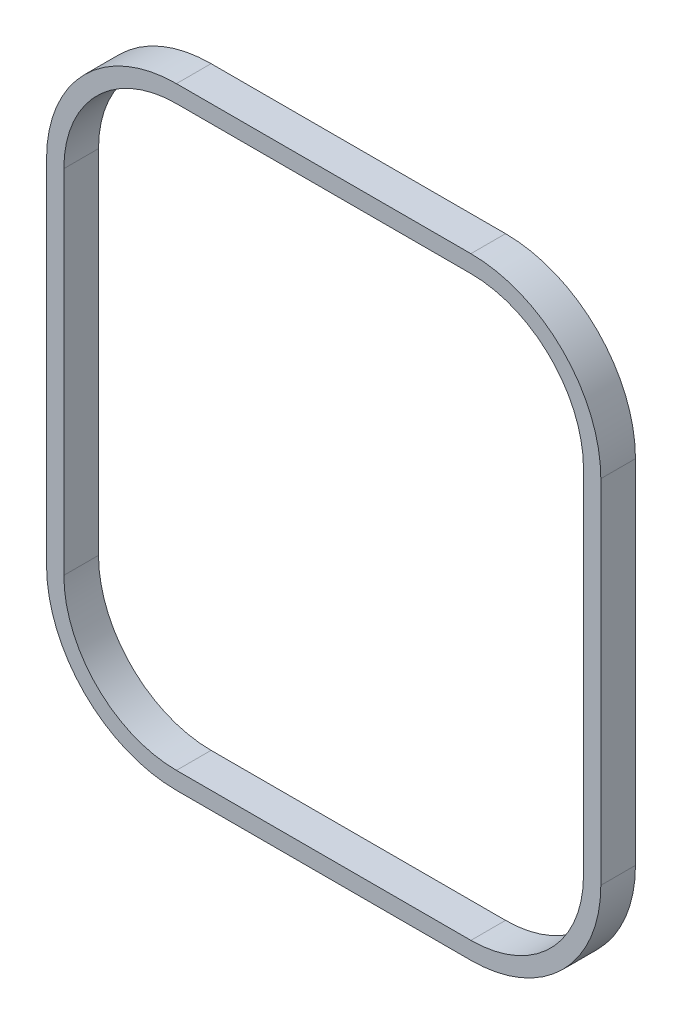
ISO-10303-21;
HEADER;
FILE_DESCRIPTION(('STEP AP214'),'2;1');
FILE_NAME('part.step','',(''),(''),'','','');
FILE_SCHEMA(('AUTOMOTIVE_DESIGN { 1 0 10303 214 1 1 1 1 }'));
ENDSEC;
DATA;
#1=APPLICATION_CONTEXT('core data for automotive mechanical design processes');
#2=APPLICATION_PROTOCOL_DEFINITION('international standard','automotive_design',2000,#1);
#3=PRODUCT_CONTEXT('',#1,'mechanical');
#4=PRODUCT('Part','Part','',(#3));
#5=PRODUCT_RELATED_PRODUCT_CATEGORY('part','',(#4));
#6=PRODUCT_DEFINITION_FORMATION('','',#4);
#7=PRODUCT_DEFINITION_CONTEXT('part definition',#1,'design');
#8=PRODUCT_DEFINITION('design','',#6,#7);
#9=PRODUCT_DEFINITION_SHAPE('','',#8);
#10=(LENGTH_UNIT() NAMED_UNIT(*) SI_UNIT(.MILLI.,.METRE.));
#11=(NAMED_UNIT(*) PLANE_ANGLE_UNIT() SI_UNIT($,.RADIAN.));
#12=(NAMED_UNIT(*) SI_UNIT($,.STERADIAN.) SOLID_ANGLE_UNIT());
#13=UNCERTAINTY_MEASURE_WITH_UNIT(LENGTH_MEASURE(1.E-05),#10,'distance_accuracy_value','');
#14=(GEOMETRIC_REPRESENTATION_CONTEXT(3) GLOBAL_UNCERTAINTY_ASSIGNED_CONTEXT((#13)) GLOBAL_UNIT_ASSIGNED_CONTEXT((#10,
#11,#12)) REPRESENTATION_CONTEXT('',''));
#15=CARTESIAN_POINT('',(0.,0.,0.));
#16=DIRECTION('',(0.,0.,1.));
#17=DIRECTION('',(1.,0.,0.));
#18=AXIS2_PLACEMENT_3D('',#15,#16,#17);
#19=CARTESIAN_POINT('',(51.,-61.,12.));
#20=DIRECTION('',(0.,0.,1.));
#21=DIRECTION('',(1.,0.,0.));
#22=AXIS2_PLACEMENT_3D('',#19,#20,#21);
#23=PLANE('',#22);
#24=CARTESIAN_POINT('',(51.,-61.,12.));
#25=DIRECTION('',(0.,0.,1.));
#26=DIRECTION('',(1.,0.,0.));
#27=AXIS2_PLACEMENT_3D('',#24,#25,#26);
#28=CIRCLE('',#27,45.);
#29=CARTESIAN_POINT('',(51.,-106.,12.));
#30=VERTEX_POINT('',#29);
#31=CARTESIAN_POINT('',(96.,-61.,12.));
#32=VERTEX_POINT('',#31);
#33=EDGE_CURVE('E261',#30,#32,#28,.T.);
#34=ORIENTED_EDGE('',*,*,#33,.T.);
#35=DIRECTION('',(0.,1.,0.));
#36=VECTOR('',#35,1.);
#37=CARTESIAN_POINT('',(96.,61.,12.));
#38=LINE('',#37,#36);
#39=CARTESIAN_POINT('',(96.,61.,12.));
#40=VERTEX_POINT('',#39);
#41=EDGE_CURVE('E264',#32,#40,#38,.T.);
#42=ORIENTED_EDGE('',*,*,#41,.T.);
#43=CARTESIAN_POINT('',(51.,61.,12.));
#44=DIRECTION('',(0.,0.,1.));
#45=DIRECTION('',(1.,0.,0.));
#46=AXIS2_PLACEMENT_3D('',#43,#44,#45);
#47=CIRCLE('',#46,45.);
#48=CARTESIAN_POINT('',(51.,106.,12.));
#49=VERTEX_POINT('',#48);
#50=EDGE_CURVE('E267',#40,#49,#47,.T.);
#51=ORIENTED_EDGE('',*,*,#50,.T.);
#52=DIRECTION('',(-1.,0.,0.));
#53=VECTOR('',#52,1.);
#54=CARTESIAN_POINT('',(-51.,106.,12.));
#55=LINE('',#54,#53);
#56=CARTESIAN_POINT('',(-51.,106.,12.));
#57=VERTEX_POINT('',#56);
#58=EDGE_CURVE('E269',#49,#57,#55,.T.);
#59=ORIENTED_EDGE('',*,*,#58,.T.);
#60=CARTESIAN_POINT('',(-51.,61.,12.));
#61=DIRECTION('',(0.,0.,1.));
#62=DIRECTION('',(1.,0.,0.));
#63=AXIS2_PLACEMENT_3D('',#60,#61,#62);
#64=CIRCLE('',#63,45.);
#65=CARTESIAN_POINT('',(-96.,61.,12.));
#66=VERTEX_POINT('',#65);
#67=EDGE_CURVE('E271',#57,#66,#64,.T.);
#68=ORIENTED_EDGE('',*,*,#67,.T.);
#69=DIRECTION('',(0.,-1.,0.));
#70=VECTOR('',#69,1.);
#71=CARTESIAN_POINT('',(-96.,61.,12.));
#72=LINE('',#71,#70);
#73=CARTESIAN_POINT('',(-96.,-61.,12.));
#74=VERTEX_POINT('',#73);
#75=EDGE_CURVE('E273',#66,#74,#72,.T.);
#76=ORIENTED_EDGE('',*,*,#75,.T.);
#77=CARTESIAN_POINT('',(-51.,-61.,12.));
#78=DIRECTION('',(0.,0.,1.));
#79=DIRECTION('',(1.,0.,0.));
#80=AXIS2_PLACEMENT_3D('',#77,#78,#79);
#81=CIRCLE('',#80,45.);
#82=CARTESIAN_POINT('',(-51.,-106.,12.));
#83=VERTEX_POINT('',#82);
#84=EDGE_CURVE('E275',#74,#83,#81,.T.);
#85=ORIENTED_EDGE('',*,*,#84,.T.);
#86=DIRECTION('',(1.,0.,0.));
#87=VECTOR('',#86,1.);
#88=CARTESIAN_POINT('',(-51.,-106.,12.));
#89=LINE('',#88,#87);
#90=EDGE_CURVE('E277',#83,#30,#89,.T.);
#91=ORIENTED_EDGE('',*,*,#90,.T.);
#92=EDGE_LOOP('',(#34,#42,#51,#59,#68,#76,#85,#91));
#93=FACE_BOUND('',#92,.T.);
#94=DIRECTION('',(0.,1.,0.));
#95=VECTOR('',#94,1.);
#96=CARTESIAN_POINT('',(90.,61.,12.));
#97=LINE('',#96,#95);
#98=CARTESIAN_POINT('',(90.,-61.,12.));
#99=VERTEX_POINT('',#98);
#100=CARTESIAN_POINT('',(90.,61.,12.));
#101=VERTEX_POINT('',#100);
#102=EDGE_CURVE('E204',#99,#101,#97,.T.);
#103=ORIENTED_EDGE('',*,*,#102,.F.);
#104=CARTESIAN_POINT('',(51.,-61.,12.));
#105=DIRECTION('',(0.,0.,1.));
#106=DIRECTION('',(1.,0.,0.));
#107=AXIS2_PLACEMENT_3D('',#104,#105,#106);
#108=CIRCLE('',#107,39.);
#109=CARTESIAN_POINT('',(51.,-100.,12.));
#110=VERTEX_POINT('',#109);
#111=EDGE_CURVE('E196',#110,#99,#108,.T.);
#112=ORIENTED_EDGE('',*,*,#111,.F.);
#113=DIRECTION('',(1.,0.,0.));
#114=VECTOR('',#113,1.);
#115=CARTESIAN_POINT('',(-51.,-100.,12.));
#116=LINE('',#115,#114);
#117=CARTESIAN_POINT('',(-51.,-100.,12.));
#118=VERTEX_POINT('',#117);
#119=EDGE_CURVE('E229',#118,#110,#116,.T.);
#120=ORIENTED_EDGE('',*,*,#119,.F.);
#121=CARTESIAN_POINT('',(-51.,-61.,12.));
#122=DIRECTION('',(0.,0.,1.));
#123=DIRECTION('',(1.,0.,0.));
#124=AXIS2_PLACEMENT_3D('',#121,#122,#123);
#125=CIRCLE('',#124,39.);
#126=CARTESIAN_POINT('',(-90.,-61.,12.));
#127=VERTEX_POINT('',#126);
#128=EDGE_CURVE('E227',#127,#118,#125,.T.);
#129=ORIENTED_EDGE('',*,*,#128,.F.);
#130=DIRECTION('',(0.,-1.,0.));
#131=VECTOR('',#130,1.);
#132=CARTESIAN_POINT('',(-90.,61.,12.));
#133=LINE('',#132,#131);
#134=CARTESIAN_POINT('',(-90.,61.,12.));
#135=VERTEX_POINT('',#134);
#136=EDGE_CURVE('E225',#135,#127,#133,.T.);
#137=ORIENTED_EDGE('',*,*,#136,.F.);
#138=CARTESIAN_POINT('',(-51.,61.,12.));
#139=DIRECTION('',(0.,0.,1.));
#140=DIRECTION('',(1.,0.,0.));
#141=AXIS2_PLACEMENT_3D('',#138,#139,#140);
#142=CIRCLE('',#141,39.);
#143=CARTESIAN_POINT('',(-51.,100.,12.));
#144=VERTEX_POINT('',#143);
#145=EDGE_CURVE('E223',#144,#135,#142,.T.);
#146=ORIENTED_EDGE('',*,*,#145,.F.);
#147=DIRECTION('',(-1.,0.,0.));
#148=VECTOR('',#147,1.);
#149=CARTESIAN_POINT('',(-51.,100.,12.));
#150=LINE('',#149,#148);
#151=CARTESIAN_POINT('',(51.,100.,12.));
#152=VERTEX_POINT('',#151);
#153=EDGE_CURVE('E219',#152,#144,#150,.T.);
#154=ORIENTED_EDGE('',*,*,#153,.F.);
#155=CARTESIAN_POINT('',(51.,61.,12.));
#156=DIRECTION('',(0.,0.,1.));
#157=DIRECTION('',(-1.,0.,0.));
#158=AXIS2_PLACEMENT_3D('',#155,#156,#157);
#159=CIRCLE('',#158,39.);
#160=EDGE_CURVE('E217',#101,#152,#159,.T.);
#161=ORIENTED_EDGE('',*,*,#160,.F.);
#162=EDGE_LOOP('',(#103,#112,#120,#129,#137,#146,#154,#161));
#163=FACE_BOUND('',#162,.T.);
#164=ADVANCED_FACE('F83',(#93,#163),#23,.T.);
#165=CARTESIAN_POINT('',(51.,-61.,0.));
#166=DIRECTION('',(0.,0.,1.));
#167=DIRECTION('',(1.,0.,0.));
#168=AXIS2_PLACEMENT_3D('',#165,#166,#167);
#169=PLANE('',#168);
#170=CARTESIAN_POINT('',(51.,-61.,0.));
#171=DIRECTION('',(0.,0.,1.));
#172=DIRECTION('',(1.,0.,0.));
#173=AXIS2_PLACEMENT_3D('',#170,#171,#172);
#174=CIRCLE('',#173,45.);
#175=CARTESIAN_POINT('',(51.,-106.,0.));
#176=VERTEX_POINT('',#175);
#177=CARTESIAN_POINT('',(96.,-61.,0.));
#178=VERTEX_POINT('',#177);
#179=EDGE_CURVE('E212',#176,#178,#174,.T.);
#180=ORIENTED_EDGE('',*,*,#179,.F.);
#181=DIRECTION('',(1.,0.,0.));
#182=VECTOR('',#181,1.);
#183=CARTESIAN_POINT('',(-51.,-106.,0.));
#184=LINE('',#183,#182);
#185=CARTESIAN_POINT('',(-51.,-106.,0.));
#186=VERTEX_POINT('',#185);
#187=EDGE_CURVE('E265',#186,#176,#184,.T.);
#188=ORIENTED_EDGE('',*,*,#187,.F.);
#189=CARTESIAN_POINT('',(-51.,-61.,0.));
#190=DIRECTION('',(0.,0.,1.));
#191=DIRECTION('',(1.,0.,0.));
#192=AXIS2_PLACEMENT_3D('',#189,#190,#191);
#193=CIRCLE('',#192,45.);
#194=CARTESIAN_POINT('',(-96.,-61.,0.));
#195=VERTEX_POINT('',#194);
#196=EDGE_CURVE('E292',#195,#186,#193,.T.);
#197=ORIENTED_EDGE('',*,*,#196,.F.);
#198=DIRECTION('',(0.,-1.,0.));
#199=VECTOR('',#198,1.);
#200=CARTESIAN_POINT('',(-96.,61.,0.));
#201=LINE('',#200,#199);
#202=CARTESIAN_POINT('',(-96.,61.,0.));
#203=VERTEX_POINT('',#202);
#204=EDGE_CURVE('E290',#203,#195,#201,.T.);
#205=ORIENTED_EDGE('',*,*,#204,.F.);
#206=CARTESIAN_POINT('',(-51.,61.,0.));
#207=DIRECTION('',(0.,0.,1.));
#208=DIRECTION('',(1.,0.,0.));
#209=AXIS2_PLACEMENT_3D('',#206,#207,#208);
#210=CIRCLE('',#209,45.);
#211=CARTESIAN_POINT('',(-51.,106.,0.));
#212=VERTEX_POINT('',#211);
#213=EDGE_CURVE('E288',#212,#203,#210,.T.);
#214=ORIENTED_EDGE('',*,*,#213,.F.);
#215=DIRECTION('',(-1.,0.,0.));
#216=VECTOR('',#215,1.);
#217=CARTESIAN_POINT('',(-51.,106.,0.));
#218=LINE('',#217,#216);
#219=CARTESIAN_POINT('',(51.,106.,0.));
#220=VERTEX_POINT('',#219);
#221=EDGE_CURVE('E286',#220,#212,#218,.T.);
#222=ORIENTED_EDGE('',*,*,#221,.F.);
#223=CARTESIAN_POINT('',(51.,61.,0.));
#224=DIRECTION('',(0.,0.,1.));
#225=DIRECTION('',(1.,0.,0.));
#226=AXIS2_PLACEMENT_3D('',#223,#224,#225);
#227=CIRCLE('',#226,45.);
#228=CARTESIAN_POINT('',(96.,61.,0.));
#229=VERTEX_POINT('',#228);
#230=EDGE_CURVE('E284',#229,#220,#227,.T.);
#231=ORIENTED_EDGE('',*,*,#230,.F.);
#232=DIRECTION('',(0.,1.,0.));
#233=VECTOR('',#232,1.);
#234=CARTESIAN_POINT('',(96.,61.,0.));
#235=LINE('',#234,#233);
#236=EDGE_CURVE('E282',#178,#229,#235,.T.);
#237=ORIENTED_EDGE('',*,*,#236,.F.);
#238=EDGE_LOOP('',(#180,#188,#197,#205,#214,#222,#231,#237));
#239=FACE_BOUND('',#238,.T.);
#240=CARTESIAN_POINT('',(51.,-61.,0.));
#241=DIRECTION('',(0.,0.,1.));
#242=DIRECTION('',(1.,0.,0.));
#243=AXIS2_PLACEMENT_3D('',#240,#241,#242);
#244=CIRCLE('',#243,39.);
#245=CARTESIAN_POINT('',(51.,-100.,0.));
#246=VERTEX_POINT('',#245);
#247=CARTESIAN_POINT('',(90.,-61.,0.));
#248=VERTEX_POINT('',#247);
#249=EDGE_CURVE('E106',#246,#248,#244,.T.);
#250=ORIENTED_EDGE('',*,*,#249,.T.);
#251=DIRECTION('',(0.,1.,0.));
#252=VECTOR('',#251,1.);
#253=CARTESIAN_POINT('',(90.,61.,0.));
#254=LINE('',#253,#252);
#255=CARTESIAN_POINT('',(90.,61.,0.));
#256=VERTEX_POINT('',#255);
#257=EDGE_CURVE('E211',#248,#256,#254,.T.);
#258=ORIENTED_EDGE('',*,*,#257,.T.);
#259=CARTESIAN_POINT('',(51.,61.,0.));
#260=DIRECTION('',(0.,0.,1.));
#261=DIRECTION('',(-1.,0.,0.));
#262=AXIS2_PLACEMENT_3D('',#259,#260,#261);
#263=CIRCLE('',#262,39.);
#264=CARTESIAN_POINT('',(51.,100.,0.));
#265=VERTEX_POINT('',#264);
#266=EDGE_CURVE('E233',#256,#265,#263,.T.);
#267=ORIENTED_EDGE('',*,*,#266,.T.);
#268=DIRECTION('',(-1.,0.,0.));
#269=VECTOR('',#268,1.);
#270=CARTESIAN_POINT('',(-51.,100.,0.));
#271=LINE('',#270,#269);
#272=CARTESIAN_POINT('',(-51.,100.,0.));
#273=VERTEX_POINT('',#272);
#274=EDGE_CURVE('E236',#265,#273,#271,.T.);
#275=ORIENTED_EDGE('',*,*,#274,.T.);
#276=CARTESIAN_POINT('',(-51.,61.,0.));
#277=DIRECTION('',(0.,0.,1.));
#278=DIRECTION('',(1.,0.,0.));
#279=AXIS2_PLACEMENT_3D('',#276,#277,#278);
#280=CIRCLE('',#279,39.);
#281=CARTESIAN_POINT('',(-90.,61.,0.));
#282=VERTEX_POINT('',#281);
#283=EDGE_CURVE('E239',#273,#282,#280,.T.);
#284=ORIENTED_EDGE('',*,*,#283,.T.);
#285=DIRECTION('',(0.,-1.,0.));
#286=VECTOR('',#285,1.);
#287=CARTESIAN_POINT('',(-90.,61.,0.));
#288=LINE('',#287,#286);
#289=CARTESIAN_POINT('',(-90.,-61.,0.));
#290=VERTEX_POINT('',#289);
#291=EDGE_CURVE('E242',#282,#290,#288,.T.);
#292=ORIENTED_EDGE('',*,*,#291,.T.);
#293=CARTESIAN_POINT('',(-51.,-61.,0.));
#294=DIRECTION('',(0.,0.,1.));
#295=DIRECTION('',(1.,0.,0.));
#296=AXIS2_PLACEMENT_3D('',#293,#294,#295);
#297=CIRCLE('',#296,39.);
#298=CARTESIAN_POINT('',(-51.,-100.,0.));
#299=VERTEX_POINT('',#298);
#300=EDGE_CURVE('E245',#290,#299,#297,.T.);
#301=ORIENTED_EDGE('',*,*,#300,.T.);
#302=DIRECTION('',(1.,0.,0.));
#303=VECTOR('',#302,1.);
#304=CARTESIAN_POINT('',(-51.,-100.,0.));
#305=LINE('',#304,#303);
#306=EDGE_CURVE('E205',#299,#246,#305,.T.);
#307=ORIENTED_EDGE('',*,*,#306,.T.);
#308=EDGE_LOOP('',(#250,#258,#267,#275,#284,#292,#301,#307));
#309=FACE_BOUND('',#308,.T.);
#310=ADVANCED_FACE('F322',(#239,#309),#169,.F.);
#311=CARTESIAN_POINT('',(51.,-61.,12.));
#312=DIRECTION('',(0.,0.,-1.));
#313=DIRECTION('',(-1.,0.,0.));
#314=AXIS2_PLACEMENT_3D('',#311,#312,#313);
#315=CYLINDRICAL_SURFACE('',#314,45.);
#316=ORIENTED_EDGE('',*,*,#179,.T.);
#317=DIRECTION('',(0.,0.,-1.));
#318=VECTOR('',#317,1.);
#319=CARTESIAN_POINT('',(96.,-61.,12.));
#320=LINE('',#319,#318);
#321=EDGE_CURVE('E12',#32,#178,#320,.T.);
#322=ORIENTED_EDGE('',*,*,#321,.F.);
#323=ORIENTED_EDGE('',*,*,#33,.F.);
#324=DIRECTION('',(0.,0.,-1.));
#325=VECTOR('',#324,1.);
#326=CARTESIAN_POINT('',(51.,-106.,12.));
#327=LINE('',#326,#325);
#328=EDGE_CURVE('E279',#30,#176,#327,.T.);
#329=ORIENTED_EDGE('',*,*,#328,.T.);
#330=EDGE_LOOP('',(#316,#322,#323,#329));
#331=FACE_BOUND('',#330,.T.);
#332=ADVANCED_FACE('F85',(#331),#315,.T.);
#333=CARTESIAN_POINT('',(96.,61.,12.));
#334=DIRECTION('',(-1.,0.,0.));
#335=DIRECTION('',(0.,-1.,0.));
#336=AXIS2_PLACEMENT_3D('',#333,#334,#335);
#337=PLANE('',#336);
#338=ORIENTED_EDGE('',*,*,#236,.T.);
#339=DIRECTION('',(0.,0.,-1.));
#340=VECTOR('',#339,1.);
#341=CARTESIAN_POINT('',(96.,61.,12.));
#342=LINE('',#341,#340);
#343=EDGE_CURVE('E91',#40,#229,#342,.T.);
#344=ORIENTED_EDGE('',*,*,#343,.F.);
#345=ORIENTED_EDGE('',*,*,#41,.F.);
#346=ORIENTED_EDGE('',*,*,#321,.T.);
#347=EDGE_LOOP('',(#338,#344,#345,#346));
#348=FACE_BOUND('',#347,.T.);
#349=ADVANCED_FACE('F339',(#348),#337,.F.);
#350=CARTESIAN_POINT('',(51.,61.,12.));
#351=DIRECTION('',(0.,0.,-1.));
#352=DIRECTION('',(-1.,0.,0.));
#353=AXIS2_PLACEMENT_3D('',#350,#351,#352);
#354=CYLINDRICAL_SURFACE('',#353,45.);
#355=ORIENTED_EDGE('',*,*,#230,.T.);
#356=DIRECTION('',(0.,0.,-1.));
#357=VECTOR('',#356,1.);
#358=CARTESIAN_POINT('',(51.,106.,12.));
#359=LINE('',#358,#357);
#360=EDGE_CURVE('E309',#49,#220,#359,.T.);
#361=ORIENTED_EDGE('',*,*,#360,.F.);
#362=ORIENTED_EDGE('',*,*,#50,.F.);
#363=ORIENTED_EDGE('',*,*,#343,.T.);
#364=EDGE_LOOP('',(#355,#361,#362,#363));
#365=FACE_BOUND('',#364,.T.);
#366=ADVANCED_FACE('F316',(#365),#354,.T.);
#367=CARTESIAN_POINT('',(-51.,106.,12.));
#368=DIRECTION('',(0.,-1.,0.));
#369=DIRECTION('',(0.,0.,-1.));
#370=AXIS2_PLACEMENT_3D('',#367,#368,#369);
#371=PLANE('',#370);
#372=ORIENTED_EDGE('',*,*,#221,.T.);
#373=DIRECTION('',(0.,0.,-1.));
#374=VECTOR('',#373,1.);
#375=CARTESIAN_POINT('',(-51.,106.,12.));
#376=LINE('',#375,#374);
#377=EDGE_CURVE('E306',#57,#212,#376,.T.);
#378=ORIENTED_EDGE('',*,*,#377,.F.);
#379=ORIENTED_EDGE('',*,*,#58,.F.);
#380=ORIENTED_EDGE('',*,*,#360,.T.);
#381=EDGE_LOOP('',(#372,#378,#379,#380));
#382=FACE_BOUND('',#381,.T.);
#383=ADVANCED_FACE('F328',(#382),#371,.F.);
#384=CARTESIAN_POINT('',(-51.,61.,12.));
#385=DIRECTION('',(0.,0.,-1.));
#386=DIRECTION('',(-1.,0.,0.));
#387=AXIS2_PLACEMENT_3D('',#384,#385,#386);
#388=CYLINDRICAL_SURFACE('',#387,45.);
#389=ORIENTED_EDGE('',*,*,#213,.T.);
#390=DIRECTION('',(0.,0.,-1.));
#391=VECTOR('',#390,1.);
#392=CARTESIAN_POINT('',(-96.,61.,12.));
#393=LINE('',#392,#391);
#394=EDGE_CURVE('E303',#66,#203,#393,.T.);
#395=ORIENTED_EDGE('',*,*,#394,.F.);
#396=ORIENTED_EDGE('',*,*,#67,.F.);
#397=ORIENTED_EDGE('',*,*,#377,.T.);
#398=EDGE_LOOP('',(#389,#395,#396,#397));
#399=FACE_BOUND('',#398,.T.);
#400=ADVANCED_FACE('F332',(#399),#388,.T.);
#401=CARTESIAN_POINT('',(-96.,61.,12.));
#402=DIRECTION('',(1.,0.,0.));
#403=DIRECTION('',(0.,1.,0.));
#404=AXIS2_PLACEMENT_3D('',#401,#402,#403);
#405=PLANE('',#404);
#406=ORIENTED_EDGE('',*,*,#204,.T.);
#407=DIRECTION('',(0.,0.,-1.));
#408=VECTOR('',#407,1.);
#409=CARTESIAN_POINT('',(-96.,-61.,12.));
#410=LINE('',#409,#408);
#411=EDGE_CURVE('E300',#74,#195,#410,.T.);
#412=ORIENTED_EDGE('',*,*,#411,.F.);
#413=ORIENTED_EDGE('',*,*,#75,.F.);
#414=ORIENTED_EDGE('',*,*,#394,.T.);
#415=EDGE_LOOP('',(#406,#412,#413,#414));
#416=FACE_BOUND('',#415,.T.);
#417=ADVANCED_FACE('F352',(#416),#405,.F.);
#418=CARTESIAN_POINT('',(-51.,-61.,12.));
#419=DIRECTION('',(0.,0.,-1.));
#420=DIRECTION('',(-1.,0.,0.));
#421=AXIS2_PLACEMENT_3D('',#418,#419,#420);
#422=CYLINDRICAL_SURFACE('',#421,45.);
#423=ORIENTED_EDGE('',*,*,#196,.T.);
#424=DIRECTION('',(0.,0.,-1.));
#425=VECTOR('',#424,1.);
#426=CARTESIAN_POINT('',(-51.,-106.,12.));
#427=LINE('',#426,#425);
#428=EDGE_CURVE('E297',#83,#186,#427,.T.);
#429=ORIENTED_EDGE('',*,*,#428,.F.);
#430=ORIENTED_EDGE('',*,*,#84,.F.);
#431=ORIENTED_EDGE('',*,*,#411,.T.);
#432=EDGE_LOOP('',(#423,#429,#430,#431));
#433=FACE_BOUND('',#432,.T.);
#434=ADVANCED_FACE('F350',(#433),#422,.T.);
#435=CARTESIAN_POINT('',(-51.,-106.,12.));
#436=DIRECTION('',(0.,1.,0.));
#437=DIRECTION('',(-1.,0.,0.));
#438=AXIS2_PLACEMENT_3D('',#435,#436,#437);
#439=PLANE('',#438);
#440=ORIENTED_EDGE('',*,*,#187,.T.);
#441=ORIENTED_EDGE('',*,*,#328,.F.);
#442=ORIENTED_EDGE('',*,*,#90,.F.);
#443=ORIENTED_EDGE('',*,*,#428,.T.);
#444=EDGE_LOOP('',(#440,#441,#442,#443));
#445=FACE_BOUND('',#444,.T.);
#446=ADVANCED_FACE('F345',(#445),#439,.F.);
#447=CARTESIAN_POINT('',(51.,-61.,12.));
#448=DIRECTION('',(0.,0.,-1.));
#449=DIRECTION('',(-1.,0.,0.));
#450=AXIS2_PLACEMENT_3D('',#447,#448,#449);
#451=CYLINDRICAL_SURFACE('',#450,39.);
#452=ORIENTED_EDGE('',*,*,#249,.F.);
#453=DIRECTION('',(0.,0.,-1.));
#454=VECTOR('',#453,1.);
#455=CARTESIAN_POINT('',(51.,-100.,12.));
#456=LINE('',#455,#454);
#457=EDGE_CURVE('E200',#110,#246,#456,.T.);
#458=ORIENTED_EDGE('',*,*,#457,.F.);
#459=ORIENTED_EDGE('',*,*,#111,.T.);
#460=DIRECTION('',(0.,0.,-1.));
#461=VECTOR('',#460,1.);
#462=CARTESIAN_POINT('',(90.,-61.,12.));
#463=LINE('',#462,#461);
#464=EDGE_CURVE('E199',#99,#248,#463,.T.);
#465=ORIENTED_EDGE('',*,*,#464,.T.);
#466=EDGE_LOOP('',(#452,#458,#459,#465));
#467=FACE_BOUND('',#466,.T.);
#468=ADVANCED_FACE('F198',(#467),#451,.F.);
#469=CARTESIAN_POINT('',(90.,61.,12.));
#470=DIRECTION('',(-1.,0.,0.));
#471=DIRECTION('',(0.,-1.,0.));
#472=AXIS2_PLACEMENT_3D('',#469,#470,#471);
#473=PLANE('',#472);
#474=ORIENTED_EDGE('',*,*,#257,.F.);
#475=ORIENTED_EDGE('',*,*,#464,.F.);
#476=ORIENTED_EDGE('',*,*,#102,.T.);
#477=DIRECTION('',(0.,0.,-1.));
#478=VECTOR('',#477,1.);
#479=CARTESIAN_POINT('',(90.,61.,12.));
#480=LINE('',#479,#478);
#481=EDGE_CURVE('E213',#101,#256,#480,.T.);
#482=ORIENTED_EDGE('',*,*,#481,.T.);
#483=EDGE_LOOP('',(#474,#475,#476,#482));
#484=FACE_BOUND('',#483,.T.);
#485=ADVANCED_FACE('F208',(#484),#473,.T.);
#486=CARTESIAN_POINT('',(51.,61.,12.));
#487=DIRECTION('',(0.,0.,-1.));
#488=DIRECTION('',(-1.,0.,0.));
#489=AXIS2_PLACEMENT_3D('',#486,#487,#488);
#490=CYLINDRICAL_SURFACE('',#489,39.);
#491=ORIENTED_EDGE('',*,*,#266,.F.);
#492=ORIENTED_EDGE('',*,*,#481,.F.);
#493=ORIENTED_EDGE('',*,*,#160,.T.);
#494=DIRECTION('',(0.,0.,-1.));
#495=VECTOR('',#494,1.);
#496=CARTESIAN_POINT('',(51.,100.,12.));
#497=LINE('',#496,#495);
#498=EDGE_CURVE('E258',#152,#265,#497,.T.);
#499=ORIENTED_EDGE('',*,*,#498,.T.);
#500=EDGE_LOOP('',(#491,#492,#493,#499));
#501=FACE_BOUND('',#500,.T.);
#502=ADVANCED_FACE('F377',(#501),#490,.F.);
#503=CARTESIAN_POINT('',(-51.,100.,12.));
#504=DIRECTION('',(0.,-1.,0.));
#505=DIRECTION('',(0.,0.,-1.));
#506=AXIS2_PLACEMENT_3D('',#503,#504,#505);
#507=PLANE('',#506);
#508=ORIENTED_EDGE('',*,*,#274,.F.);
#509=ORIENTED_EDGE('',*,*,#498,.F.);
#510=ORIENTED_EDGE('',*,*,#153,.T.);
#511=DIRECTION('',(0.,0.,-1.));
#512=VECTOR('',#511,1.);
#513=CARTESIAN_POINT('',(-51.,100.,12.));
#514=LINE('',#513,#512);
#515=EDGE_CURVE('E256',#144,#273,#514,.T.);
#516=ORIENTED_EDGE('',*,*,#515,.T.);
#517=EDGE_LOOP('',(#508,#509,#510,#516));
#518=FACE_BOUND('',#517,.T.);
#519=ADVANCED_FACE('F381',(#518),#507,.T.);
#520=CARTESIAN_POINT('',(-51.,61.,12.));
#521=DIRECTION('',(0.,0.,-1.));
#522=DIRECTION('',(-1.,0.,0.));
#523=AXIS2_PLACEMENT_3D('',#520,#521,#522);
#524=CYLINDRICAL_SURFACE('',#523,39.);
#525=ORIENTED_EDGE('',*,*,#283,.F.);
#526=ORIENTED_EDGE('',*,*,#515,.F.);
#527=ORIENTED_EDGE('',*,*,#145,.T.);
#528=DIRECTION('',(0.,0.,-1.));
#529=VECTOR('',#528,1.);
#530=CARTESIAN_POINT('',(-90.,61.,12.));
#531=LINE('',#530,#529);
#532=EDGE_CURVE('E254',#135,#282,#531,.T.);
#533=ORIENTED_EDGE('',*,*,#532,.T.);
#534=EDGE_LOOP('',(#525,#526,#527,#533));
#535=FACE_BOUND('',#534,.T.);
#536=ADVANCED_FACE('F387',(#535),#524,.F.);
#537=CARTESIAN_POINT('',(-90.,61.,12.));
#538=DIRECTION('',(1.,0.,0.));
#539=DIRECTION('',(0.,1.,0.));
#540=AXIS2_PLACEMENT_3D('',#537,#538,#539);
#541=PLANE('',#540);
#542=ORIENTED_EDGE('',*,*,#291,.F.);
#543=ORIENTED_EDGE('',*,*,#532,.F.);
#544=ORIENTED_EDGE('',*,*,#136,.T.);
#545=DIRECTION('',(0.,0.,-1.));
#546=VECTOR('',#545,1.);
#547=CARTESIAN_POINT('',(-90.,-61.,12.));
#548=LINE('',#547,#546);
#549=EDGE_CURVE('E252',#127,#290,#548,.T.);
#550=ORIENTED_EDGE('',*,*,#549,.T.);
#551=EDGE_LOOP('',(#542,#543,#544,#550));
#552=FACE_BOUND('',#551,.T.);
#553=ADVANCED_FACE('F391',(#552),#541,.T.);
#554=CARTESIAN_POINT('',(-51.,-61.,12.));
#555=DIRECTION('',(0.,0.,-1.));
#556=DIRECTION('',(-1.,0.,0.));
#557=AXIS2_PLACEMENT_3D('',#554,#555,#556);
#558=CYLINDRICAL_SURFACE('',#557,39.);
#559=ORIENTED_EDGE('',*,*,#300,.F.);
#560=ORIENTED_EDGE('',*,*,#549,.F.);
#561=ORIENTED_EDGE('',*,*,#128,.T.);
#562=DIRECTION('',(0.,0.,-1.));
#563=VECTOR('',#562,1.);
#564=CARTESIAN_POINT('',(-51.,-100.,12.));
#565=LINE('',#564,#563);
#566=EDGE_CURVE('E98',#118,#299,#565,.T.);
#567=ORIENTED_EDGE('',*,*,#566,.T.);
#568=EDGE_LOOP('',(#559,#560,#561,#567));
#569=FACE_BOUND('',#568,.T.);
#570=ADVANCED_FACE('F395',(#569),#558,.F.);
#571=CARTESIAN_POINT('',(-51.,-100.,12.));
#572=DIRECTION('',(0.,1.,0.));
#573=DIRECTION('',(-1.,0.,0.));
#574=AXIS2_PLACEMENT_3D('',#571,#572,#573);
#575=PLANE('',#574);
#576=ORIENTED_EDGE('',*,*,#306,.F.);
#577=ORIENTED_EDGE('',*,*,#566,.F.);
#578=ORIENTED_EDGE('',*,*,#119,.T.);
#579=ORIENTED_EDGE('',*,*,#457,.T.);
#580=EDGE_LOOP('',(#576,#577,#578,#579));
#581=FACE_BOUND('',#580,.T.);
#582=ADVANCED_FACE('F399',(#581),#575,.T.);
#583=CLOSED_SHELL('',(#164,#310,#332,#349,#366,#383,#400,#417,#434,#446,#468,#485,#502,#519,
#536,#553,#570,#582));
#584=MANIFOLD_SOLID_BREP('B2',#583);
#585=ADVANCED_BREP_SHAPE_REPRESENTATION('',(#18,#584),#14);
#586=SHAPE_DEFINITION_REPRESENTATION(#9,#585);
ENDSEC;
END-ISO-10303-21;
